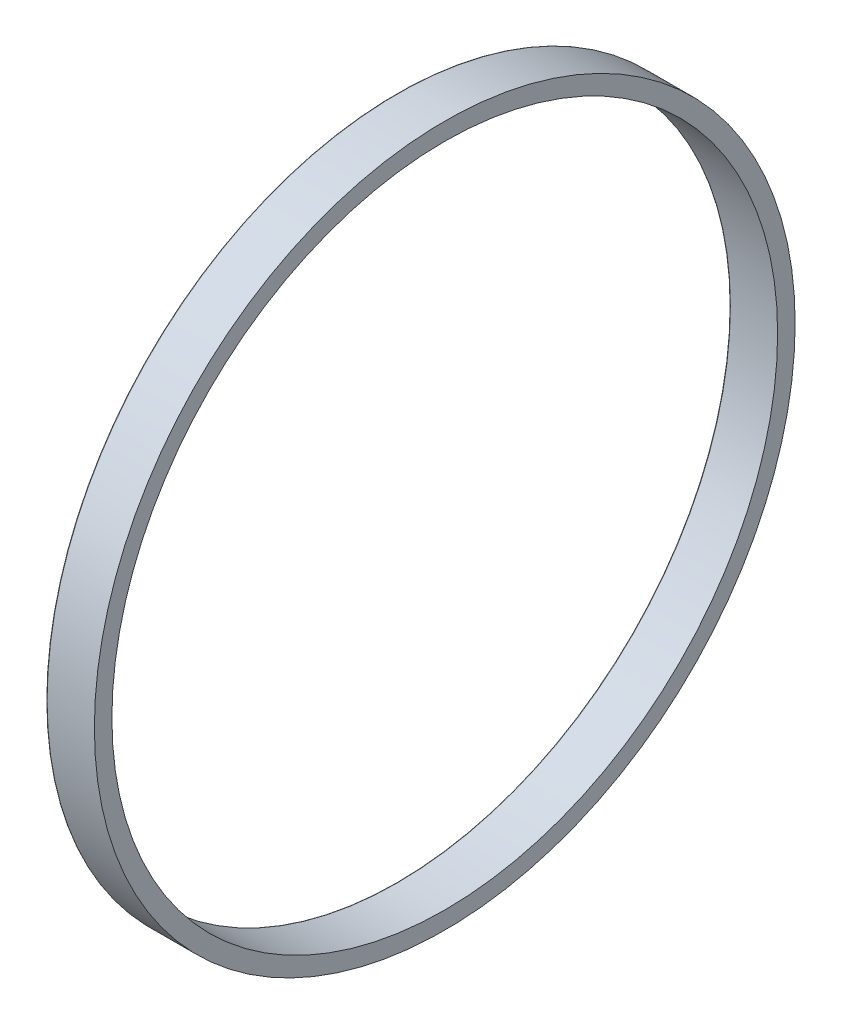
ISO-10303-21;
HEADER;
FILE_DESCRIPTION(('STEP AP214'),'2;1');
FILE_NAME('part.step','',(''),(''),'','','');
FILE_SCHEMA(('AUTOMOTIVE_DESIGN { 1 0 10303 214 1 1 1 1 }'));
ENDSEC;
DATA;
#1=APPLICATION_CONTEXT('core data for automotive mechanical design processes');
#2=APPLICATION_PROTOCOL_DEFINITION('international standard','automotive_design',2000,#1);
#3=PRODUCT_CONTEXT('',#1,'mechanical');
#4=PRODUCT('Part','Part','',(#3));
#5=PRODUCT_RELATED_PRODUCT_CATEGORY('part','',(#4));
#6=PRODUCT_DEFINITION_FORMATION('','',#4);
#7=PRODUCT_DEFINITION_CONTEXT('part definition',#1,'design');
#8=PRODUCT_DEFINITION('design','',#6,#7);
#9=PRODUCT_DEFINITION_SHAPE('','',#8);
#10=(LENGTH_UNIT() NAMED_UNIT(*) SI_UNIT(.MILLI.,.METRE.));
#11=(NAMED_UNIT(*) PLANE_ANGLE_UNIT() SI_UNIT($,.RADIAN.));
#12=(NAMED_UNIT(*) SI_UNIT($,.STERADIAN.) SOLID_ANGLE_UNIT());
#13=UNCERTAINTY_MEASURE_WITH_UNIT(LENGTH_MEASURE(1.E-05),#10,'distance_accuracy_value','');
#14=(GEOMETRIC_REPRESENTATION_CONTEXT(3) GLOBAL_UNCERTAINTY_ASSIGNED_CONTEXT((#13)) GLOBAL_UNIT_ASSIGNED_CONTEXT((#10,
#11,#12)) REPRESENTATION_CONTEXT('',''));
#15=CARTESIAN_POINT('',(0.,0.,0.));
#16=DIRECTION('',(0.,0.,1.));
#17=DIRECTION('',(1.,0.,0.));
#18=AXIS2_PLACEMENT_3D('',#15,#16,#17);
#19=CARTESIAN_POINT('',(-32.4257412527635,-38.,0.));
#20=DIRECTION('',(1.,0.,0.));
#21=DIRECTION('',(0.,0.,-1.));
#22=AXIS2_PLACEMENT_3D('',#19,#20,#21);
#23=PLANE('',#22);
#24=CARTESIAN_POINT('',(-32.4257412527635,0.,0.));
#25=DIRECTION('',(-1.,0.,0.));
#26=DIRECTION('',(0.,0.,1.));
#27=AXIS2_PLACEMENT_3D('',#24,#25,#26);
#28=CIRCLE('',#27,38.);
#29=CARTESIAN_POINT('',(-32.4257412527635,0.,38.));
#30=VERTEX_POINT('',#29);
#31=EDGE_CURVE('E72',#30,#30,#28,.T.);
#32=ORIENTED_EDGE('',*,*,#31,.T.);
#33=EDGE_LOOP('',(#32));
#34=FACE_BOUND('',#33,.T.);
#35=CARTESIAN_POINT('',(-32.4257412527635,0.,0.));
#36=DIRECTION('',(-1.,0.,0.));
#37=DIRECTION('',(0.,0.,1.));
#38=AXIS2_PLACEMENT_3D('',#35,#36,#37);
#39=CIRCLE('',#38,40.);
#40=CARTESIAN_POINT('',(-32.4257412527635,0.,40.));
#41=VERTEX_POINT('',#40);
#42=EDGE_CURVE('E10',#41,#41,#39,.T.);
#43=ORIENTED_EDGE('',*,*,#42,.F.);
#44=EDGE_LOOP('',(#43));
#45=FACE_BOUND('',#44,.T.);
#46=ADVANCED_FACE('F34',(#34,#45),#23,.T.);
#47=CARTESIAN_POINT('',(-83.2087468972477,0.,0.));
#48=DIRECTION('',(-1.,0.,0.));
#49=DIRECTION('',(0.,0.,1.));
#50=AXIS2_PLACEMENT_3D('',#47,#48,#49);
#51=CYLINDRICAL_SURFACE('',#50,40.);
#52=ORIENTED_EDGE('',*,*,#42,.T.);
#53=EDGE_LOOP('',(#52));
#54=FACE_BOUND('',#53,.T.);
#55=CARTESIAN_POINT('',(-37.8095134867467,0.,0.));
#56=DIRECTION('',(-1.,0.,0.));
#57=DIRECTION('',(0.,0.,1.));
#58=AXIS2_PLACEMENT_3D('',#55,#56,#57);
#59=CIRCLE('',#58,40.);
#60=CARTESIAN_POINT('',(-37.8095134867467,0.,40.));
#61=VERTEX_POINT('',#60);
#62=EDGE_CURVE('E41',#61,#61,#59,.T.);
#63=ORIENTED_EDGE('',*,*,#62,.F.);
#64=EDGE_LOOP('',(#63));
#65=FACE_BOUND('',#64,.T.);
#66=ADVANCED_FACE('F92',(#54,#65),#51,.T.);
#67=CARTESIAN_POINT('',(-37.8095134867467,0.,0.));
#68=DIRECTION('',(-1.,0.,0.));
#69=DIRECTION('',(0.,0.,1.));
#70=AXIS2_PLACEMENT_3D('',#67,#68,#69);
#71=TOROIDAL_SURFACE('',#70,39.9,0.1);
#72=ORIENTED_EDGE('',*,*,#62,.T.);
#73=EDGE_LOOP('',(#72));
#74=FACE_BOUND('',#73,.T.);
#75=CARTESIAN_POINT('',(-37.8411362633484,0.,0.));
#76=DIRECTION('',(-1.,0.,0.));
#77=DIRECTION('',(0.,0.,1.));
#78=AXIS2_PLACEMENT_3D('',#75,#76,#77);
#79=CIRCLE('',#78,39.8051316701949);
#80=CARTESIAN_POINT('',(-37.8411362633484,0.,39.8051316701949));
#81=VERTEX_POINT('',#80);
#82=EDGE_CURVE('E48',#81,#81,#79,.T.);
#83=ORIENTED_EDGE('',*,*,#82,.F.);
#84=EDGE_LOOP('',(#83));
#85=FACE_BOUND('',#84,.T.);
#86=ADVANCED_FACE('F96',(#74,#85),#71,.T.);
#87=CARTESIAN_POINT('',(-35.9949512315939,0.,0.));
#88=DIRECTION('',(-1.,0.,0.));
#89=DIRECTION('',(0.,0.,1.));
#90=AXIS2_PLACEMENT_3D('',#87,#88,#89);
#91=CONICAL_SURFACE('',#90,39.1897366596101,0.321750554396649);
#92=ORIENTED_EDGE('',*,*,#82,.T.);
#93=EDGE_LOOP('',(#92));
#94=FACE_BOUND('',#93,.T.);
#95=CARTESIAN_POINT('',(-35.9949512315939,0.,0.));
#96=DIRECTION('',(-1.,0.,0.));
#97=DIRECTION('',(0.,0.,1.));
#98=AXIS2_PLACEMENT_3D('',#95,#96,#97);
#99=CIRCLE('',#98,39.1897366596101);
#100=CARTESIAN_POINT('',(-35.9949512315939,0.,39.1897366596101));
#101=VERTEX_POINT('',#100);
#102=EDGE_CURVE('E54',#101,#101,#99,.T.);
#103=ORIENTED_EDGE('',*,*,#102,.F.);
#104=EDGE_LOOP('',(#103));
#105=FACE_BOUND('',#104,.T.);
#106=ADVANCED_FACE('F100',(#94,#105),#91,.F.);
#107=CARTESIAN_POINT('',(-36.0581967847972,0.,0.));
#108=DIRECTION('',(-1.,0.,0.));
#109=DIRECTION('',(0.,0.,1.));
#110=AXIS2_PLACEMENT_3D('',#107,#108,#109);
#111=TOROIDAL_SURFACE('',#110,39.,0.200000000000011);
#112=ORIENTED_EDGE('',*,*,#102,.T.);
#113=EDGE_LOOP('',(#112));
#114=FACE_BOUND('',#113,.T.);
#115=CARTESIAN_POINT('',(-35.9949512315939,0.,0.));
#116=DIRECTION('',(-1.,0.,0.));
#117=DIRECTION('',(0.,0.,1.));
#118=AXIS2_PLACEMENT_3D('',#115,#116,#117);
#119=CIRCLE('',#118,38.8102633403899);
#120=CARTESIAN_POINT('',(-35.9949512315939,0.,38.8102633403899));
#121=VERTEX_POINT('',#120);
#122=EDGE_CURVE('E60',#121,#121,#119,.T.);
#123=ORIENTED_EDGE('',*,*,#122,.F.);
#124=EDGE_LOOP('',(#123));
#125=FACE_BOUND('',#124,.T.);
#126=ADVANCED_FACE('F106',(#114,#125),#111,.F.);
#127=CARTESIAN_POINT('',(-37.8411362633484,0.,0.));
#128=DIRECTION('',(1.,0.,0.));
#129=DIRECTION('',(0.,0.,-1.));
#130=AXIS2_PLACEMENT_3D('',#127,#128,#129);
#131=CONICAL_SURFACE('',#130,38.194868329805,0.32175055439664);
#132=ORIENTED_EDGE('',*,*,#122,.T.);
#133=EDGE_LOOP('',(#132));
#134=FACE_BOUND('',#133,.T.);
#135=CARTESIAN_POINT('',(-37.8411362633484,0.,0.));
#136=DIRECTION('',(-1.,0.,0.));
#137=DIRECTION('',(0.,0.,1.));
#138=AXIS2_PLACEMENT_3D('',#135,#136,#137);
#139=CIRCLE('',#138,38.194868329805);
#140=CARTESIAN_POINT('',(-37.8411362633484,0.,38.194868329805));
#141=VERTEX_POINT('',#140);
#142=EDGE_CURVE('E64',#141,#141,#139,.T.);
#143=ORIENTED_EDGE('',*,*,#142,.F.);
#144=EDGE_LOOP('',(#143));
#145=FACE_BOUND('',#144,.T.);
#146=ADVANCED_FACE('F88',(#134,#145),#131,.T.);
#147=CARTESIAN_POINT('',(-37.8095134867467,0.,0.));
#148=DIRECTION('',(-1.,0.,0.));
#149=DIRECTION('',(0.,0.,1.));
#150=AXIS2_PLACEMENT_3D('',#147,#148,#149);
#151=TOROIDAL_SURFACE('',#150,38.1,0.0999999999999967);
#152=ORIENTED_EDGE('',*,*,#142,.T.);
#153=EDGE_LOOP('',(#152));
#154=FACE_BOUND('',#153,.T.);
#155=CARTESIAN_POINT('',(-37.8095134867467,0.,0.));
#156=DIRECTION('',(-1.,0.,0.));
#157=DIRECTION('',(0.,0.,1.));
#158=AXIS2_PLACEMENT_3D('',#155,#156,#157);
#159=CIRCLE('',#158,38.);
#160=CARTESIAN_POINT('',(-37.8095134867467,0.,38.));
#161=VERTEX_POINT('',#160);
#162=EDGE_CURVE('E68',#161,#161,#159,.T.);
#163=ORIENTED_EDGE('',*,*,#162,.F.);
#164=EDGE_LOOP('',(#163));
#165=FACE_BOUND('',#164,.T.);
#166=ADVANCED_FACE('F82',(#154,#165),#151,.T.);
#167=CARTESIAN_POINT('',(-83.2087468972477,0.,0.));
#168=DIRECTION('',(-1.,0.,0.));
#169=DIRECTION('',(0.,0.,1.));
#170=AXIS2_PLACEMENT_3D('',#167,#168,#169);
#171=CYLINDRICAL_SURFACE('',#170,38.);
#172=ORIENTED_EDGE('',*,*,#162,.T.);
#173=EDGE_LOOP('',(#172));
#174=FACE_BOUND('',#173,.T.);
#175=ORIENTED_EDGE('',*,*,#31,.F.);
#176=EDGE_LOOP('',(#175));
#177=FACE_BOUND('',#176,.T.);
#178=ADVANCED_FACE('F80',(#174,#177),#171,.F.);
#179=CLOSED_SHELL('',(#46,#66,#86,#106,#126,#146,#166,#178));
#180=MANIFOLD_SOLID_BREP('B2',#179);
#181=ADVANCED_BREP_SHAPE_REPRESENTATION('',(#18,#180),#14);
#182=SHAPE_DEFINITION_REPRESENTATION(#9,#181);
ENDSEC;
END-ISO-10303-21;
